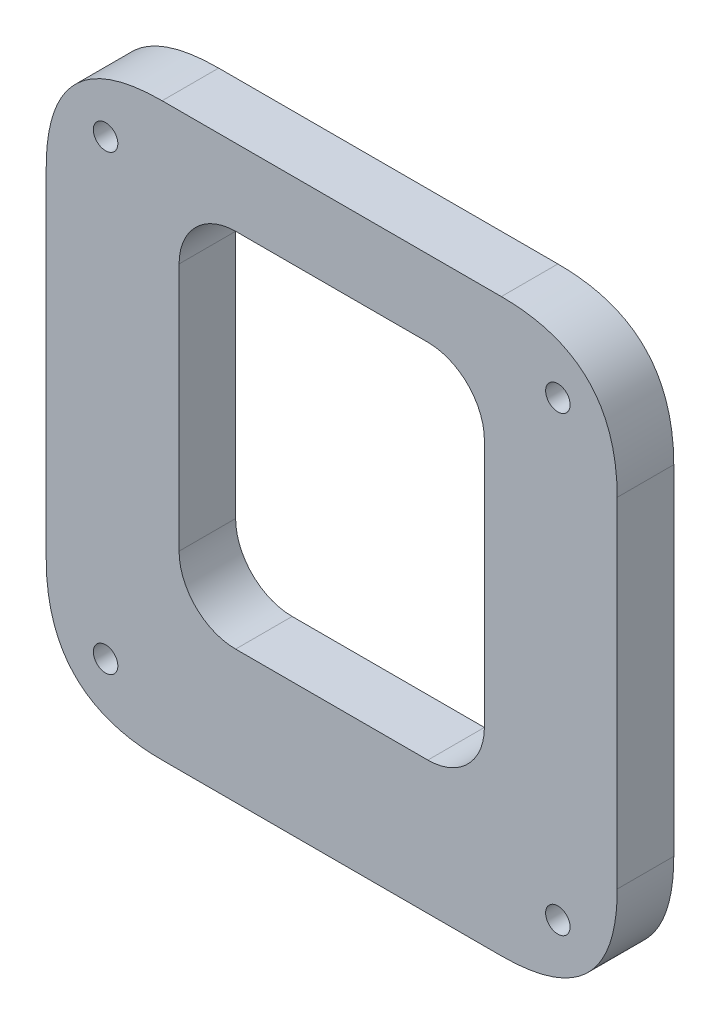
ISO-10303-21;
HEADER;
FILE_DESCRIPTION(('STEP AP214'),'2;1');
FILE_NAME('part.step','',(''),(''),'','','');
FILE_SCHEMA(('AUTOMOTIVE_DESIGN { 1 0 10303 214 1 1 1 1 }'));
ENDSEC;
DATA;
#1=APPLICATION_CONTEXT('core data for automotive mechanical design processes');
#2=APPLICATION_PROTOCOL_DEFINITION('international standard','automotive_design',2000,#1);
#3=PRODUCT_CONTEXT('',#1,'mechanical');
#4=PRODUCT('Part','Part','',(#3));
#5=PRODUCT_RELATED_PRODUCT_CATEGORY('part','',(#4));
#6=PRODUCT_DEFINITION_FORMATION('','',#4);
#7=PRODUCT_DEFINITION_CONTEXT('part definition',#1,'design');
#8=PRODUCT_DEFINITION('design','',#6,#7);
#9=PRODUCT_DEFINITION_SHAPE('','',#8);
#10=(LENGTH_UNIT() NAMED_UNIT(*) SI_UNIT(.MILLI.,.METRE.));
#11=(NAMED_UNIT(*) PLANE_ANGLE_UNIT() SI_UNIT($,.RADIAN.));
#12=(NAMED_UNIT(*) SI_UNIT($,.STERADIAN.) SOLID_ANGLE_UNIT());
#13=UNCERTAINTY_MEASURE_WITH_UNIT(LENGTH_MEASURE(1.E-05),#10,'distance_accuracy_value','');
#14=(GEOMETRIC_REPRESENTATION_CONTEXT(3) GLOBAL_UNCERTAINTY_ASSIGNED_CONTEXT((#13)) GLOBAL_UNIT_ASSIGNED_CONTEXT((#10,
#11,#12)) REPRESENTATION_CONTEXT('',''));
#15=CARTESIAN_POINT('',(0.,0.,0.));
#16=DIRECTION('',(0.,0.,1.));
#17=DIRECTION('',(1.,0.,0.));
#18=AXIS2_PLACEMENT_3D('',#15,#16,#17);
#19=CARTESIAN_POINT('',(60.72,60.72,-3.5));
#20=DIRECTION('',(0.,0.,1.));
#21=DIRECTION('',(1.,0.,0.));
#22=AXIS2_PLACEMENT_3D('',#19,#20,#21);
#23=PLANE('',#22);
#24=CARTESIAN_POINT('',(-40.,40.,-3.5));
#25=DIRECTION('',(0.,0.,1.));
#26=DIRECTION('',(1.,1.40812774357872E-11,0.));
#27=AXIS2_PLACEMENT_3D('',#24,#25,#26);
#28=CIRCLE('',#27,2.1660000004678);
#29=CARTESIAN_POINT('',(-42.1660000004678,39.9999999999695,-3.5));
#30=VERTEX_POINT('',#29);
#31=EDGE_CURVE('E192',#30,#30,#28,.T.);
#32=ORIENTED_EDGE('',*,*,#31,.T.);
#33=EDGE_LOOP('',(#32));
#34=FACE_BOUND('',#33,.T.);
#35=CARTESIAN_POINT('',(40.,40.,-3.5));
#36=DIRECTION('',(0.,0.,1.));
#37=DIRECTION('',(1.,1.40812774357872E-11,0.));
#38=AXIS2_PLACEMENT_3D('',#35,#36,#37);
#39=CIRCLE('',#38,2.1660000004678);
#40=CARTESIAN_POINT('',(37.8339999995322,39.9999999999695,-3.5));
#41=VERTEX_POINT('',#40);
#42=EDGE_CURVE('E196',#41,#41,#39,.T.);
#43=ORIENTED_EDGE('',*,*,#42,.T.);
#44=EDGE_LOOP('',(#43));
#45=FACE_BOUND('',#44,.T.);
#46=CARTESIAN_POINT('',(-40.,-40.,-3.5));
#47=DIRECTION('',(0.,0.,1.));
#48=DIRECTION('',(1.,1.40792271624273E-11,0.));
#49=AXIS2_PLACEMENT_3D('',#46,#47,#48);
#50=CIRCLE('',#49,2.1660000004678);
#51=CARTESIAN_POINT('',(-42.1660000004678,-40.0000000000305,-3.5));
#52=VERTEX_POINT('',#51);
#53=EDGE_CURVE('E282',#52,#52,#50,.T.);
#54=ORIENTED_EDGE('',*,*,#53,.T.);
#55=EDGE_LOOP('',(#54));
#56=FACE_BOUND('',#55,.T.);
#57=CARTESIAN_POINT('',(40.,-40.,-3.5));
#58=DIRECTION('',(0.,0.,1.));
#59=DIRECTION('',(1.,1.40792271624273E-11,0.));
#60=AXIS2_PLACEMENT_3D('',#57,#58,#59);
#61=CIRCLE('',#60,2.1660000004678);
#62=CARTESIAN_POINT('',(37.8339999995322,-40.0000000000305,-3.5));
#63=VERTEX_POINT('',#62);
#64=EDGE_CURVE('E231',#63,#63,#61,.T.);
#65=ORIENTED_EDGE('',*,*,#64,.T.);
#66=EDGE_LOOP('',(#65));
#67=FACE_BOUND('',#66,.T.);
#68=DIRECTION('',(0.,-1.,0.));
#69=VECTOR('',#68,1.);
#70=CARTESIAN_POINT('',(-27.0000000149012,43.86,-3.5));
#71=LINE('',#70,#69);
#72=CARTESIAN_POINT('',(-27.0000000149012,27.,-3.5));
#73=VERTEX_POINT('',#72);
#74=CARTESIAN_POINT('',(-27.0000000149011,-17.,-3.5));
#75=VERTEX_POINT('',#74);
#76=EDGE_CURVE('E281',#73,#75,#71,.T.);
#77=ORIENTED_EDGE('',*,*,#76,.T.);
#78=CARTESIAN_POINT('',(-17.,-17.,-3.5));
#79=DIRECTION('',(0.,0.,1.));
#80=DIRECTION('',(0.,-1.,0.));
#81=AXIS2_PLACEMENT_3D('',#78,#79,#80);
#82=CIRCLE('',#81,10.0000000149011);
#83=CARTESIAN_POINT('',(-17.,-27.0000000149012,-3.5));
#84=VERTEX_POINT('',#83);
#85=EDGE_CURVE('E201',#75,#84,#82,.T.);
#86=ORIENTED_EDGE('',*,*,#85,.T.);
#87=DIRECTION('',(1.,0.,0.));
#88=VECTOR('',#87,1.);
#89=CARTESIAN_POINT('',(21.86,-27.0000000149012,-3.5));
#90=LINE('',#89,#88);
#91=CARTESIAN_POINT('',(17.,-27.0000000149013,-3.5));
#92=VERTEX_POINT('',#91);
#93=EDGE_CURVE('E234',#84,#92,#90,.T.);
#94=ORIENTED_EDGE('',*,*,#93,.T.);
#95=CARTESIAN_POINT('',(17.,-17.,-3.5));
#96=DIRECTION('',(0.,0.,1.));
#97=DIRECTION('',(1.,0.,0.));
#98=AXIS2_PLACEMENT_3D('',#95,#96,#97);
#99=CIRCLE('',#98,10.0000000149012);
#100=CARTESIAN_POINT('',(27.0000000149012,-17.,-3.5));
#101=VERTEX_POINT('',#100);
#102=EDGE_CURVE('E21',#92,#101,#99,.T.);
#103=ORIENTED_EDGE('',*,*,#102,.T.);
#104=DIRECTION('',(0.,1.,0.));
#105=VECTOR('',#104,1.);
#106=CARTESIAN_POINT('',(27.0000000149012,21.86,-3.5));
#107=LINE('',#106,#105);
#108=CARTESIAN_POINT('',(27.0000000149012,27.,-3.5));
#109=VERTEX_POINT('',#108);
#110=EDGE_CURVE('E142',#101,#109,#107,.T.);
#111=ORIENTED_EDGE('',*,*,#110,.T.);
#112=CARTESIAN_POINT('',(17.,27.,-3.5));
#113=DIRECTION('',(0.,0.,1.));
#114=DIRECTION('',(0.,1.,0.));
#115=AXIS2_PLACEMENT_3D('',#112,#113,#114);
#116=CIRCLE('',#115,10.0000000149011);
#117=CARTESIAN_POINT('',(17.,37.0000000149011,-3.5));
#118=VERTEX_POINT('',#117);
#119=EDGE_CURVE('E345',#109,#118,#116,.T.);
#120=ORIENTED_EDGE('',*,*,#119,.T.);
#121=DIRECTION('',(-1.,0.,0.));
#122=VECTOR('',#121,1.);
#123=CARTESIAN_POINT('',(38.86,37.0000000149011,-3.5));
#124=LINE('',#123,#122);
#125=CARTESIAN_POINT('',(-17.,37.0000000149011,-3.5));
#126=VERTEX_POINT('',#125);
#127=EDGE_CURVE('E272',#118,#126,#124,.T.);
#128=ORIENTED_EDGE('',*,*,#127,.T.);
#129=CARTESIAN_POINT('',(-17.,27.,-3.5));
#130=DIRECTION('',(0.,0.,1.));
#131=DIRECTION('',(-1.,0.,0.));
#132=AXIS2_PLACEMENT_3D('',#129,#130,#131);
#133=CIRCLE('',#132,10.0000000149011);
#134=EDGE_CURVE('E222',#126,#73,#133,.T.);
#135=ORIENTED_EDGE('',*,*,#134,.T.);
#136=EDGE_LOOP('',(#77,#86,#94,#103,#111,#120,#128,#135));
#137=FACE_BOUND('',#136,.T.);
#138=CARTESIAN_POINT('',(-50.5,-30.,-3.5));
#139=CARTESIAN_POINT('',(-50.5,-37.3611962471327,-3.5));
#140=CARTESIAN_POINT('',(-48.4765265707625,-42.8270116661058,-3.5));
#141=CARTESIAN_POINT('',(-40.9522938769251,-49.101778205086,-3.5));
#142=CARTESIAN_POINT('',(-36.1388037528673,-50.5,-3.5));
#143=CARTESIAN_POINT('',(-30.,-50.5,-3.5));
#144=(BOUNDED_CURVE() B_SPLINE_CURVE(3,(#138,#139,#140,#141,#142,#143),.UNSPECIFIED.,.F.,
.F.) B_SPLINE_CURVE_WITH_KNOTS((4,2,4),(-34.138082637111,-15.5234807265474,0.),
.UNSPECIFIED.) CURVE() GEOMETRIC_REPRESENTATION_ITEM() RATIONAL_B_SPLINE_CURVE((1.,1.,1.,1.,1.,1.)) REPRESENTATION_ITEM(''));
#145=CARTESIAN_POINT('',(-50.5,-30.,-3.5));
#146=VERTEX_POINT('',#145);
#147=CARTESIAN_POINT('',(-30.,-50.5,-3.5));
#148=VERTEX_POINT('',#147);
#149=EDGE_CURVE('E11',#146,#148,#144,.T.);
#150=ORIENTED_EDGE('',*,*,#149,.F.);
#151=DIRECTION('',(0.,-1.,0.));
#152=VECTOR('',#151,1.);
#153=CARTESIAN_POINT('',(-50.5,30.,-3.5));
#154=LINE('',#153,#152);
#155=CARTESIAN_POINT('',(-50.5,30.,-3.5));
#156=VERTEX_POINT('',#155);
#157=EDGE_CURVE('E230',#156,#146,#154,.T.);
#158=ORIENTED_EDGE('',*,*,#157,.F.);
#159=CARTESIAN_POINT('',(-30.,50.5,-3.5));
#160=CARTESIAN_POINT('',(-37.3611962471327,50.5,-3.5));
#161=CARTESIAN_POINT('',(-42.8270116661058,48.4765265707626,-3.5));
#162=CARTESIAN_POINT('',(-49.1017782050861,40.9522938769252,-3.5));
#163=CARTESIAN_POINT('',(-50.5,36.1388037528673,-3.5));
#164=CARTESIAN_POINT('',(-50.5,30.,-3.5));
#165=(BOUNDED_CURVE() B_SPLINE_CURVE(3,(#159,#160,#161,#162,#163,#164),.UNSPECIFIED.,.F.,
.F.) B_SPLINE_CURVE_WITH_KNOTS((4,2,4),(-34.1380826371111,-15.5234807265475,0.),
.UNSPECIFIED.) CURVE() GEOMETRIC_REPRESENTATION_ITEM() RATIONAL_B_SPLINE_CURVE((1.,1.,1.,1.,1.,1.)) REPRESENTATION_ITEM(''));
#166=CARTESIAN_POINT('',(-30.,50.5,-3.5));
#167=VERTEX_POINT('',#166);
#168=EDGE_CURVE('E298',#167,#156,#165,.T.);
#169=ORIENTED_EDGE('',*,*,#168,.F.);
#170=DIRECTION('',(-1.,0.,0.));
#171=VECTOR('',#170,1.);
#172=CARTESIAN_POINT('',(30.,50.5,-3.5));
#173=LINE('',#172,#171);
#174=CARTESIAN_POINT('',(30.,50.5,-3.5));
#175=VERTEX_POINT('',#174);
#176=EDGE_CURVE('E294',#175,#167,#173,.T.);
#177=ORIENTED_EDGE('',*,*,#176,.F.);
#178=CARTESIAN_POINT('',(50.5,30.,-3.5));
#179=CARTESIAN_POINT('',(50.5,37.3611962471327,-3.5));
#180=CARTESIAN_POINT('',(48.4765265707625,42.8270116661058,-3.5));
#181=CARTESIAN_POINT('',(40.9522938769251,49.101778205086,-3.5));
#182=CARTESIAN_POINT('',(36.1388037528673,50.5,-3.5));
#183=CARTESIAN_POINT('',(30.,50.5,-3.5));
#184=(BOUNDED_CURVE() B_SPLINE_CURVE(3,(#178,#179,#180,#181,#182,#183),.UNSPECIFIED.,.F.,
.F.) B_SPLINE_CURVE_WITH_KNOTS((4,2,4),(-34.138082637111,-15.5234807265474,0.),
.UNSPECIFIED.) CURVE() GEOMETRIC_REPRESENTATION_ITEM() RATIONAL_B_SPLINE_CURVE((1.,1.,1.,1.,1.,1.)) REPRESENTATION_ITEM(''));
#185=CARTESIAN_POINT('',(50.5,30.,-3.5));
#186=VERTEX_POINT('',#185);
#187=EDGE_CURVE('E293',#186,#175,#184,.T.);
#188=ORIENTED_EDGE('',*,*,#187,.F.);
#189=DIRECTION('',(0.,1.,0.));
#190=VECTOR('',#189,1.);
#191=CARTESIAN_POINT('',(50.5,-30.,-3.5));
#192=LINE('',#191,#190);
#193=CARTESIAN_POINT('',(50.5,-30.,-3.5));
#194=VERTEX_POINT('',#193);
#195=EDGE_CURVE('E248',#194,#186,#192,.T.);
#196=ORIENTED_EDGE('',*,*,#195,.F.);
#197=CARTESIAN_POINT('',(30.,-50.5,-3.5));
#198=CARTESIAN_POINT('',(37.3611962471328,-50.5,-3.5));
#199=CARTESIAN_POINT('',(42.8270116661059,-48.4765265707625,-3.5));
#200=CARTESIAN_POINT('',(49.1017782050861,-40.952293876925,-3.5));
#201=CARTESIAN_POINT('',(50.5,-36.1388037528672,-3.5));
#202=CARTESIAN_POINT('',(50.5,-30.,-3.5));
#203=(BOUNDED_CURVE() B_SPLINE_CURVE(3,(#197,#198,#199,#200,#201,#202),.UNSPECIFIED.,.F.,
.F.) B_SPLINE_CURVE_WITH_KNOTS((4,2,4),(-34.1380826371111,-15.5234807265473,0.),
.UNSPECIFIED.) CURVE() GEOMETRIC_REPRESENTATION_ITEM() RATIONAL_B_SPLINE_CURVE((1.,1.,1.,1.,1.,1.)) REPRESENTATION_ITEM(''));
#204=CARTESIAN_POINT('',(30.,-50.5,-3.5));
#205=VERTEX_POINT('',#204);
#206=EDGE_CURVE('E221',#205,#194,#203,.T.);
#207=ORIENTED_EDGE('',*,*,#206,.F.);
#208=DIRECTION('',(1.,0.,0.));
#209=VECTOR('',#208,1.);
#210=CARTESIAN_POINT('',(-30.,-50.5,-3.5));
#211=LINE('',#210,#209);
#212=EDGE_CURVE('E220',#148,#205,#211,.T.);
#213=ORIENTED_EDGE('',*,*,#212,.F.);
#214=EDGE_LOOP('',(#150,#158,#169,#177,#188,#196,#207,#213));
#215=FACE_BOUND('',#214,.T.);
#216=ADVANCED_FACE('F17',(#34,#45,#56,#67,#137,#215),#23,.F.);
#217=CARTESIAN_POINT('',(-50.5,-30.,-3.5));
#218=CARTESIAN_POINT('',(-50.5,-30.,8.5));
#219=CARTESIAN_POINT('',(-50.5,-37.3611962471327,-3.5));
#220=CARTESIAN_POINT('',(-50.5,-37.3611962471327,8.5));
#221=CARTESIAN_POINT('',(-48.4765265707625,-42.8270116661058,-3.5));
#222=CARTESIAN_POINT('',(-48.4765265707625,-42.8270116661058,8.5));
#223=CARTESIAN_POINT('',(-44.3737596471752,-46.2484774363558,-3.5));
#224=CARTESIAN_POINT('',(-44.3737596471752,-46.2484774363558,8.5));
#225=CARTESIAN_POINT('',(-40.9522938769251,-49.101778205086,-3.5));
#226=CARTESIAN_POINT('',(-40.9522938769251,-49.101778205086,8.5));
#227=CARTESIAN_POINT('',(-36.1388037528673,-50.5,-3.5));
#228=CARTESIAN_POINT('',(-36.1388037528673,-50.5,8.5));
#229=CARTESIAN_POINT('',(-30.,-50.5,-3.5));
#230=CARTESIAN_POINT('',(-30.,-50.5,8.5));
#231=(BOUNDED_SURFACE() B_SPLINE_SURFACE(3,1,((#217,#218),(#219,#220),(#221,#222),(#223,#224),
(#225,#226),(#227,#228),(#229,#230)),.UNSPECIFIED.,.F.,.F.,.F.) B_SPLINE_SURFACE_WITH_KNOTS((4,
3,4),(2,2),(-34.138082637111,-15.5234807265474,0.),(0.,1.2),
.UNSPECIFIED.) GEOMETRIC_REPRESENTATION_ITEM() RATIONAL_B_SPLINE_SURFACE(((1.,1.),(1.,1.),(1.,
1.),(1.,1.),(1.,1.),(1.,1.),(1.,1.))) REPRESENTATION_ITEM('') SURFACE());
#232=DIRECTION('',(0.,0.,1.));
#233=VECTOR('',#232,1.);
#234=CARTESIAN_POINT('',(-30.,-50.5,-3.5));
#235=LINE('',#234,#233);
#236=CARTESIAN_POINT('',(-30.,-50.5,6.5));
#237=VERTEX_POINT('',#236);
#238=EDGE_CURVE('E28',#148,#237,#235,.T.);
#239=CARTESIAN_POINT('',(-50.5,-30.,6.5));
#240=CARTESIAN_POINT('',(-50.5,-37.3611962471327,6.5));
#241=CARTESIAN_POINT('',(-48.4765265707625,-42.8270116661058,6.5));
#242=CARTESIAN_POINT('',(-40.9522938769251,-49.101778205086,6.5));
#243=CARTESIAN_POINT('',(-36.1388037528673,-50.5,6.5));
#244=CARTESIAN_POINT('',(-30.,-50.5,6.5));
#245=(BOUNDED_CURVE() B_SPLINE_CURVE(3,(#239,#240,#241,#242,#243,#244),.UNSPECIFIED.,.F.,
.F.) B_SPLINE_CURVE_WITH_KNOTS((4,2,4),(-34.138082637111,-15.5234807265474,0.),
.UNSPECIFIED.) CURVE() GEOMETRIC_REPRESENTATION_ITEM() RATIONAL_B_SPLINE_CURVE((1.,1.,1.,1.,1.,1.)) REPRESENTATION_ITEM(''));
#246=CARTESIAN_POINT('',(-50.5,-30.,6.5));
#247=VERTEX_POINT('',#246);
#248=EDGE_CURVE('E299',#247,#237,#245,.T.);
#249=DIRECTION('',(0.,0.,1.));
#250=VECTOR('',#249,1.);
#251=CARTESIAN_POINT('',(-50.5,-30.,-3.5));
#252=LINE('',#251,#250);
#253=EDGE_CURVE('E241',#146,#247,#252,.T.);
#254=ORIENTED_EDGE('',*,*,#149,.T.);
#255=ORIENTED_EDGE('',*,*,#238,.T.);
#256=ORIENTED_EDGE('',*,*,#248,.F.);
#257=ORIENTED_EDGE('',*,*,#253,.F.);
#258=EDGE_LOOP('',(#254,#255,#256,#257));
#259=FACE_BOUND('',#258,.T.);
#260=ADVANCED_FACE('F454',(#259),#231,.T.);
#261=CARTESIAN_POINT('',(-30.,-50.5,-3.5));
#262=DIRECTION('',(0.,-1.,0.));
#263=DIRECTION('',(0.,0.,-1.));
#264=AXIS2_PLACEMENT_3D('',#261,#262,#263);
#265=PLANE('',#264);
#266=ORIENTED_EDGE('',*,*,#212,.T.);
#267=DIRECTION('',(0.,0.,1.));
#268=VECTOR('',#267,1.);
#269=CARTESIAN_POINT('',(30.,-50.5,-3.5));
#270=LINE('',#269,#268);
#271=CARTESIAN_POINT('',(30.,-50.5,6.5));
#272=VERTEX_POINT('',#271);
#273=EDGE_CURVE('E216',#205,#272,#270,.T.);
#274=ORIENTED_EDGE('',*,*,#273,.T.);
#275=DIRECTION('',(1.,0.,0.));
#276=VECTOR('',#275,1.);
#277=CARTESIAN_POINT('',(-30.,-50.5,6.5));
#278=LINE('',#277,#276);
#279=EDGE_CURVE('E305',#237,#272,#278,.T.);
#280=ORIENTED_EDGE('',*,*,#279,.F.);
#281=ORIENTED_EDGE('',*,*,#238,.F.);
#282=EDGE_LOOP('',(#266,#274,#280,#281));
#283=FACE_BOUND('',#282,.T.);
#284=ADVANCED_FACE('F461',(#283),#265,.T.);
#285=CARTESIAN_POINT('',(30.,-50.5,-3.5));
#286=CARTESIAN_POINT('',(30.,-50.5,8.5));
#287=CARTESIAN_POINT('',(37.3611962471328,-50.5,-3.5));
#288=CARTESIAN_POINT('',(37.3611962471328,-50.5,8.5));
#289=CARTESIAN_POINT('',(42.8270116661059,-48.4765265707625,-3.5));
#290=CARTESIAN_POINT('',(42.8270116661059,-48.4765265707625,8.5));
#291=CARTESIAN_POINT('',(46.2484774363559,-44.373759647175,-3.5));
#292=CARTESIAN_POINT('',(46.2484774363559,-44.373759647175,8.5));
#293=CARTESIAN_POINT('',(49.1017782050861,-40.952293876925,-3.5));
#294=CARTESIAN_POINT('',(49.1017782050861,-40.952293876925,8.5));
#295=CARTESIAN_POINT('',(50.5,-36.1388037528672,-3.5));
#296=CARTESIAN_POINT('',(50.5,-36.1388037528672,8.5));
#297=CARTESIAN_POINT('',(50.5,-30.,-3.5));
#298=CARTESIAN_POINT('',(50.5,-30.,8.5));
#299=(BOUNDED_SURFACE() B_SPLINE_SURFACE(3,1,((#285,#286),(#287,#288),(#289,#290),(#291,#292),
(#293,#294),(#295,#296),(#297,#298)),.UNSPECIFIED.,.F.,.F.,.F.) B_SPLINE_SURFACE_WITH_KNOTS((4,
3,4),(2,2),(-34.1380826371111,-15.5234807265473,0.),(0.,1.2),
.UNSPECIFIED.) GEOMETRIC_REPRESENTATION_ITEM() RATIONAL_B_SPLINE_SURFACE(((1.,1.),(1.,1.),(1.,
1.),(1.,1.),(1.,1.),(1.,1.),(1.,1.))) REPRESENTATION_ITEM('') SURFACE());
#300=DIRECTION('',(0.,0.,1.));
#301=VECTOR('',#300,1.);
#302=CARTESIAN_POINT('',(50.5,-30.,-3.5));
#303=LINE('',#302,#301);
#304=CARTESIAN_POINT('',(50.5,-30.,6.5));
#305=VERTEX_POINT('',#304);
#306=EDGE_CURVE('E245',#194,#305,#303,.T.);
#307=CARTESIAN_POINT('',(30.,-50.5,6.5));
#308=CARTESIAN_POINT('',(37.3611962471328,-50.5,6.5));
#309=CARTESIAN_POINT('',(42.8270116661059,-48.4765265707625,6.5));
#310=CARTESIAN_POINT('',(49.1017782050861,-40.952293876925,6.5));
#311=CARTESIAN_POINT('',(50.5,-36.1388037528672,6.5));
#312=CARTESIAN_POINT('',(50.5,-30.,6.5));
#313=(BOUNDED_CURVE() B_SPLINE_CURVE(3,(#307,#308,#309,#310,#311,#312),.UNSPECIFIED.,.F.,
.F.) B_SPLINE_CURVE_WITH_KNOTS((4,2,4),(-34.1380826371111,-15.5234807265473,0.),
.UNSPECIFIED.) CURVE() GEOMETRIC_REPRESENTATION_ITEM() RATIONAL_B_SPLINE_CURVE((1.,1.,1.,1.,1.,1.)) REPRESENTATION_ITEM(''));
#314=EDGE_CURVE('E318',#272,#305,#313,.T.);
#315=ORIENTED_EDGE('',*,*,#206,.T.);
#316=ORIENTED_EDGE('',*,*,#306,.T.);
#317=ORIENTED_EDGE('',*,*,#314,.F.);
#318=ORIENTED_EDGE('',*,*,#273,.F.);
#319=EDGE_LOOP('',(#315,#316,#317,#318));
#320=FACE_BOUND('',#319,.T.);
#321=ADVANCED_FACE('F466',(#320),#299,.T.);
#322=CARTESIAN_POINT('',(50.5,-30.,-3.5));
#323=DIRECTION('',(1.,0.,0.));
#324=DIRECTION('',(0.,1.,0.));
#325=AXIS2_PLACEMENT_3D('',#322,#323,#324);
#326=PLANE('',#325);
#327=ORIENTED_EDGE('',*,*,#195,.T.);
#328=DIRECTION('',(0.,0.,1.));
#329=VECTOR('',#328,1.);
#330=CARTESIAN_POINT('',(50.5,30.,-3.5));
#331=LINE('',#330,#329);
#332=CARTESIAN_POINT('',(50.5,30.,6.5));
#333=VERTEX_POINT('',#332);
#334=EDGE_CURVE('E417',#186,#333,#331,.T.);
#335=ORIENTED_EDGE('',*,*,#334,.T.);
#336=DIRECTION('',(0.,1.,0.));
#337=VECTOR('',#336,1.);
#338=CARTESIAN_POINT('',(50.5,-30.,6.5));
#339=LINE('',#338,#337);
#340=EDGE_CURVE('E324',#305,#333,#339,.T.);
#341=ORIENTED_EDGE('',*,*,#340,.F.);
#342=ORIENTED_EDGE('',*,*,#306,.F.);
#343=EDGE_LOOP('',(#327,#335,#341,#342));
#344=FACE_BOUND('',#343,.T.);
#345=ADVANCED_FACE('F471',(#344),#326,.T.);
#346=CARTESIAN_POINT('',(50.5,30.,-3.5));
#347=CARTESIAN_POINT('',(50.5,30.,8.5));
#348=CARTESIAN_POINT('',(50.5,37.3611962471327,-3.5));
#349=CARTESIAN_POINT('',(50.5,37.3611962471327,8.5));
#350=CARTESIAN_POINT('',(48.4765265707625,42.8270116661058,-3.5));
#351=CARTESIAN_POINT('',(48.4765265707625,42.8270116661058,8.5));
#352=CARTESIAN_POINT('',(44.3737596471752,46.2484774363558,-3.5));
#353=CARTESIAN_POINT('',(44.3737596471752,46.2484774363558,8.5));
#354=CARTESIAN_POINT('',(40.9522938769251,49.101778205086,-3.5));
#355=CARTESIAN_POINT('',(40.9522938769251,49.101778205086,8.5));
#356=CARTESIAN_POINT('',(36.1388037528673,50.5,-3.5));
#357=CARTESIAN_POINT('',(36.1388037528673,50.5,8.5));
#358=CARTESIAN_POINT('',(30.,50.5,-3.5));
#359=CARTESIAN_POINT('',(30.,50.5,8.5));
#360=(BOUNDED_SURFACE() B_SPLINE_SURFACE(3,1,((#346,#347),(#348,#349),(#350,#351),(#352,#353),
(#354,#355),(#356,#357),(#358,#359)),.UNSPECIFIED.,.F.,.F.,.F.) B_SPLINE_SURFACE_WITH_KNOTS((4,
3,4),(2,2),(-34.138082637111,-15.5234807265474,0.),(0.,1.2),
.UNSPECIFIED.) GEOMETRIC_REPRESENTATION_ITEM() RATIONAL_B_SPLINE_SURFACE(((1.,1.),(1.,1.),(1.,
1.),(1.,1.),(1.,1.),(1.,1.),(1.,1.))) REPRESENTATION_ITEM('') SURFACE());
#361=DIRECTION('',(0.,0.,1.));
#362=VECTOR('',#361,1.);
#363=CARTESIAN_POINT('',(30.,50.5,-3.5));
#364=LINE('',#363,#362);
#365=CARTESIAN_POINT('',(30.,50.5,6.5));
#366=VERTEX_POINT('',#365);
#367=EDGE_CURVE('E290',#175,#366,#364,.T.);
#368=CARTESIAN_POINT('',(50.5,30.,6.5));
#369=CARTESIAN_POINT('',(50.5,37.3611962471327,6.5));
#370=CARTESIAN_POINT('',(48.4765265707625,42.8270116661058,6.5));
#371=CARTESIAN_POINT('',(40.9522938769251,49.101778205086,6.5));
#372=CARTESIAN_POINT('',(36.1388037528673,50.5,6.5));
#373=CARTESIAN_POINT('',(30.,50.5,6.5));
#374=(BOUNDED_CURVE() B_SPLINE_CURVE(3,(#368,#369,#370,#371,#372,#373),.UNSPECIFIED.,.F.,
.F.) B_SPLINE_CURVE_WITH_KNOTS((4,2,4),(-34.138082637111,-15.5234807265474,0.),
.UNSPECIFIED.) CURVE() GEOMETRIC_REPRESENTATION_ITEM() RATIONAL_B_SPLINE_CURVE((1.,1.,1.,1.,1.,1.)) REPRESENTATION_ITEM(''));
#375=EDGE_CURVE('E263',#333,#366,#374,.T.);
#376=ORIENTED_EDGE('',*,*,#187,.T.);
#377=ORIENTED_EDGE('',*,*,#367,.T.);
#378=ORIENTED_EDGE('',*,*,#375,.F.);
#379=ORIENTED_EDGE('',*,*,#334,.F.);
#380=EDGE_LOOP('',(#376,#377,#378,#379));
#381=FACE_BOUND('',#380,.T.);
#382=ADVANCED_FACE('F510',(#381),#360,.T.);
#383=CARTESIAN_POINT('',(30.,50.5,-3.5));
#384=DIRECTION('',(0.,1.,0.));
#385=DIRECTION('',(1.,0.,0.));
#386=AXIS2_PLACEMENT_3D('',#383,#384,#385);
#387=PLANE('',#386);
#388=ORIENTED_EDGE('',*,*,#176,.T.);
#389=DIRECTION('',(0.,0.,1.));
#390=VECTOR('',#389,1.);
#391=CARTESIAN_POINT('',(-30.,50.5,-3.5));
#392=LINE('',#391,#390);
#393=CARTESIAN_POINT('',(-30.,50.5,6.5));
#394=VERTEX_POINT('',#393);
#395=EDGE_CURVE('E295',#167,#394,#392,.T.);
#396=ORIENTED_EDGE('',*,*,#395,.T.);
#397=DIRECTION('',(-1.,0.,0.));
#398=VECTOR('',#397,1.);
#399=CARTESIAN_POINT('',(30.,50.5,6.5));
#400=LINE('',#399,#398);
#401=EDGE_CURVE('E258',#366,#394,#400,.T.);
#402=ORIENTED_EDGE('',*,*,#401,.F.);
#403=ORIENTED_EDGE('',*,*,#367,.F.);
#404=EDGE_LOOP('',(#388,#396,#402,#403));
#405=FACE_BOUND('',#404,.T.);
#406=ADVANCED_FACE('F513',(#405),#387,.T.);
#407=CARTESIAN_POINT('',(-30.,50.5,-3.5));
#408=CARTESIAN_POINT('',(-30.,50.5,8.5));
#409=CARTESIAN_POINT('',(-37.3611962471327,50.5,-3.5));
#410=CARTESIAN_POINT('',(-37.3611962471327,50.5,8.5));
#411=CARTESIAN_POINT('',(-42.8270116661058,48.4765265707626,-3.5));
#412=CARTESIAN_POINT('',(-42.8270116661058,48.4765265707626,8.5));
#413=CARTESIAN_POINT('',(-46.2484774363558,44.3737596471752,-3.5));
#414=CARTESIAN_POINT('',(-46.2484774363558,44.3737596471752,8.5));
#415=CARTESIAN_POINT('',(-49.1017782050861,40.9522938769252,-3.5));
#416=CARTESIAN_POINT('',(-49.1017782050861,40.9522938769252,8.5));
#417=CARTESIAN_POINT('',(-50.5,36.1388037528673,-3.5));
#418=CARTESIAN_POINT('',(-50.5,36.1388037528673,8.5));
#419=CARTESIAN_POINT('',(-50.5,30.,-3.5));
#420=CARTESIAN_POINT('',(-50.5,30.,8.5));
#421=(BOUNDED_SURFACE() B_SPLINE_SURFACE(3,1,((#407,#408),(#409,#410),(#411,#412),(#413,#414),
(#415,#416),(#417,#418),(#419,#420)),.UNSPECIFIED.,.F.,.F.,.F.) B_SPLINE_SURFACE_WITH_KNOTS((4,
3,4),(2,2),(-34.1380826371111,-15.5234807265475,0.),(0.,1.2),
.UNSPECIFIED.) GEOMETRIC_REPRESENTATION_ITEM() RATIONAL_B_SPLINE_SURFACE(((1.,1.),(1.,1.),(1.,
1.),(1.,1.),(1.,1.),(1.,1.),(1.,1.))) REPRESENTATION_ITEM('') SURFACE());
#422=DIRECTION('',(0.,0.,1.));
#423=VECTOR('',#422,1.);
#424=CARTESIAN_POINT('',(-50.5,30.,-3.5));
#425=LINE('',#424,#423);
#426=CARTESIAN_POINT('',(-50.5,30.,6.5));
#427=VERTEX_POINT('',#426);
#428=EDGE_CURVE('E244',#156,#427,#425,.T.);
#429=CARTESIAN_POINT('',(-30.,50.5,6.5));
#430=CARTESIAN_POINT('',(-37.3611962471327,50.5,6.5));
#431=CARTESIAN_POINT('',(-42.8270116661058,48.4765265707626,6.5));
#432=CARTESIAN_POINT('',(-49.1017782050861,40.9522938769252,6.5));
#433=CARTESIAN_POINT('',(-50.5,36.1388037528673,6.5));
#434=CARTESIAN_POINT('',(-50.5,30.,6.5));
#435=(BOUNDED_CURVE() B_SPLINE_CURVE(3,(#429,#430,#431,#432,#433,#434),.UNSPECIFIED.,.F.,
.F.) B_SPLINE_CURVE_WITH_KNOTS((4,2,4),(-34.1380826371111,-15.5234807265475,0.),
.UNSPECIFIED.) CURVE() GEOMETRIC_REPRESENTATION_ITEM() RATIONAL_B_SPLINE_CURVE((1.,1.,1.,1.,1.,1.)) REPRESENTATION_ITEM(''));
#436=EDGE_CURVE('E262',#394,#427,#435,.T.);
#437=ORIENTED_EDGE('',*,*,#168,.T.);
#438=ORIENTED_EDGE('',*,*,#428,.T.);
#439=ORIENTED_EDGE('',*,*,#436,.F.);
#440=ORIENTED_EDGE('',*,*,#395,.F.);
#441=EDGE_LOOP('',(#437,#438,#439,#440));
#442=FACE_BOUND('',#441,.T.);
#443=ADVANCED_FACE('F448',(#442),#421,.T.);
#444=CARTESIAN_POINT('',(-50.5,30.,-3.5));
#445=DIRECTION('',(-1.,0.,0.));
#446=DIRECTION('',(0.,0.,1.));
#447=AXIS2_PLACEMENT_3D('',#444,#445,#446);
#448=PLANE('',#447);
#449=ORIENTED_EDGE('',*,*,#157,.T.);
#450=ORIENTED_EDGE('',*,*,#253,.T.);
#451=DIRECTION('',(0.,-1.,0.));
#452=VECTOR('',#451,1.);
#453=CARTESIAN_POINT('',(-50.5,30.,6.5));
#454=LINE('',#453,#452);
#455=EDGE_CURVE('E357',#427,#247,#454,.T.);
#456=ORIENTED_EDGE('',*,*,#455,.F.);
#457=ORIENTED_EDGE('',*,*,#428,.F.);
#458=EDGE_LOOP('',(#449,#450,#456,#457));
#459=FACE_BOUND('',#458,.T.);
#460=ADVANCED_FACE('F453',(#459),#448,.T.);
#461=CARTESIAN_POINT('',(40.,-40.,-3.5));
#462=DIRECTION('',(0.,0.,1.));
#463=DIRECTION('',(1.,1.40792271624273E-11,0.));
#464=AXIS2_PLACEMENT_3D('',#461,#462,#463);
#465=CYLINDRICAL_SURFACE('',#464,2.1660000004678);
#466=ORIENTED_EDGE('',*,*,#64,.F.);
#467=DIRECTION('',(0.,0.,1.));
#468=VECTOR('',#467,1.);
#469=CARTESIAN_POINT('',(37.8339999995322,-40.0000000000305,-3.5));
#470=LINE('',#469,#468);
#471=CARTESIAN_POINT('',(37.8339999995322,-40.0000000000305,6.5));
#472=VERTEX_POINT('',#471);
#473=EDGE_CURVE('E227',#63,#472,#470,.T.);
#474=ORIENTED_EDGE('',*,*,#473,.T.);
#475=CARTESIAN_POINT('',(40.,-40.,6.5));
#476=DIRECTION('',(0.,0.,-1.));
#477=DIRECTION('',(1.,1.40792271624273E-11,0.));
#478=AXIS2_PLACEMENT_3D('',#475,#476,#477);
#479=CIRCLE('',#478,2.1660000004678);
#480=EDGE_CURVE('E264',#472,#472,#479,.T.);
#481=ORIENTED_EDGE('',*,*,#480,.F.);
#482=ORIENTED_EDGE('',*,*,#473,.F.);
#483=EDGE_LOOP('',(#466,#474,#481,#482));
#484=FACE_BOUND('',#483,.T.);
#485=ADVANCED_FACE('F500',(#484),#465,.F.);
#486=CARTESIAN_POINT('',(-40.,-40.,-3.5));
#487=DIRECTION('',(0.,0.,1.));
#488=DIRECTION('',(1.,1.40792271624273E-11,0.));
#489=AXIS2_PLACEMENT_3D('',#486,#487,#488);
#490=CYLINDRICAL_SURFACE('',#489,2.1660000004678);
#491=ORIENTED_EDGE('',*,*,#53,.F.);
#492=DIRECTION('',(0.,0.,1.));
#493=VECTOR('',#492,1.);
#494=CARTESIAN_POINT('',(-42.1660000004678,-40.0000000000305,-3.5));
#495=LINE('',#494,#493);
#496=CARTESIAN_POINT('',(-42.1660000004678,-40.0000000000305,6.5));
#497=VERTEX_POINT('',#496);
#498=EDGE_CURVE('E286',#52,#497,#495,.T.);
#499=ORIENTED_EDGE('',*,*,#498,.T.);
#500=CARTESIAN_POINT('',(-40.,-40.,6.5));
#501=DIRECTION('',(0.,0.,-1.));
#502=DIRECTION('',(1.,1.40792271624273E-11,0.));
#503=AXIS2_PLACEMENT_3D('',#500,#501,#502);
#504=CIRCLE('',#503,2.1660000004678);
#505=EDGE_CURVE('E268',#497,#497,#504,.T.);
#506=ORIENTED_EDGE('',*,*,#505,.F.);
#507=ORIENTED_EDGE('',*,*,#498,.F.);
#508=EDGE_LOOP('',(#491,#499,#506,#507));
#509=FACE_BOUND('',#508,.T.);
#510=ADVANCED_FACE('F491',(#509),#490,.F.);
#511=CARTESIAN_POINT('',(40.,40.,-3.5));
#512=DIRECTION('',(0.,0.,1.));
#513=DIRECTION('',(1.,1.40812774357872E-11,0.));
#514=AXIS2_PLACEMENT_3D('',#511,#512,#513);
#515=CYLINDRICAL_SURFACE('',#514,2.1660000004678);
#516=ORIENTED_EDGE('',*,*,#42,.F.);
#517=DIRECTION('',(0.,0.,1.));
#518=VECTOR('',#517,1.);
#519=CARTESIAN_POINT('',(37.8339999995322,39.9999999999695,-3.5));
#520=LINE('',#519,#518);
#521=CARTESIAN_POINT('',(37.8339999995322,39.9999999999695,6.5));
#522=VERTEX_POINT('',#521);
#523=EDGE_CURVE('E277',#41,#522,#520,.T.);
#524=ORIENTED_EDGE('',*,*,#523,.T.);
#525=CARTESIAN_POINT('',(40.,40.,6.5));
#526=DIRECTION('',(0.,0.,-1.));
#527=DIRECTION('',(1.,1.40812774357872E-11,0.));
#528=AXIS2_PLACEMENT_3D('',#525,#526,#527);
#529=CIRCLE('',#528,2.1660000004678);
#530=EDGE_CURVE('E306',#522,#522,#529,.T.);
#531=ORIENTED_EDGE('',*,*,#530,.F.);
#532=ORIENTED_EDGE('',*,*,#523,.F.);
#533=EDGE_LOOP('',(#516,#524,#531,#532));
#534=FACE_BOUND('',#533,.T.);
#535=ADVANCED_FACE('F19',(#534),#515,.F.);
#536=CARTESIAN_POINT('',(-40.,40.,-3.5));
#537=DIRECTION('',(0.,0.,1.));
#538=DIRECTION('',(1.,1.40812774357872E-11,0.));
#539=AXIS2_PLACEMENT_3D('',#536,#537,#538);
#540=CYLINDRICAL_SURFACE('',#539,2.1660000004678);
#541=ORIENTED_EDGE('',*,*,#31,.F.);
#542=DIRECTION('',(0.,0.,1.));
#543=VECTOR('',#542,1.);
#544=CARTESIAN_POINT('',(-42.1660000004678,39.9999999999695,-3.5));
#545=LINE('',#544,#543);
#546=CARTESIAN_POINT('',(-42.1660000004678,39.9999999999695,6.5));
#547=VERTEX_POINT('',#546);
#548=EDGE_CURVE('E189',#30,#547,#545,.T.);
#549=ORIENTED_EDGE('',*,*,#548,.T.);
#550=CARTESIAN_POINT('',(-40.,40.,6.5));
#551=DIRECTION('',(0.,0.,-1.));
#552=DIRECTION('',(1.,1.40812774357872E-11,0.));
#553=AXIS2_PLACEMENT_3D('',#550,#551,#552);
#554=CIRCLE('',#553,2.1660000004678);
#555=EDGE_CURVE('E194',#547,#547,#554,.T.);
#556=ORIENTED_EDGE('',*,*,#555,.F.);
#557=ORIENTED_EDGE('',*,*,#548,.F.);
#558=EDGE_LOOP('',(#541,#549,#556,#557));
#559=FACE_BOUND('',#558,.T.);
#560=ADVANCED_FACE('F191',(#559),#540,.F.);
#561=CARTESIAN_POINT('',(-17.,-17.,-3.5));
#562=DIRECTION('',(0.,0.,1.));
#563=DIRECTION('',(0.,-1.,0.));
#564=AXIS2_PLACEMENT_3D('',#561,#562,#563);
#565=CYLINDRICAL_SURFACE('',#564,10.0000000149011);
#566=DIRECTION('',(0.,0.,1.));
#567=VECTOR('',#566,1.);
#568=CARTESIAN_POINT('',(-17.,-27.0000000149012,1.5));
#569=LINE('',#568,#567);
#570=CARTESIAN_POINT('',(-17.,-27.0000000149012,6.5));
#571=VERTEX_POINT('',#570);
#572=EDGE_CURVE('E207',#84,#571,#569,.T.);
#573=ORIENTED_EDGE('',*,*,#572,.F.);
#574=ORIENTED_EDGE('',*,*,#85,.F.);
#575=DIRECTION('',(0.,0.,1.));
#576=VECTOR('',#575,1.);
#577=CARTESIAN_POINT('',(-27.0000000149011,-17.,-3.5));
#578=LINE('',#577,#576);
#579=CARTESIAN_POINT('',(-27.0000000149011,-17.,6.5));
#580=VERTEX_POINT('',#579);
#581=EDGE_CURVE('E278',#75,#580,#578,.T.);
#582=ORIENTED_EDGE('',*,*,#581,.T.);
#583=CARTESIAN_POINT('',(-17.,-17.,6.5));
#584=DIRECTION('',(0.,0.,-1.));
#585=DIRECTION('',(0.,-1.,0.));
#586=AXIS2_PLACEMENT_3D('',#583,#584,#585);
#587=CIRCLE('',#586,10.0000000149011);
#588=EDGE_CURVE('E269',#571,#580,#587,.T.);
#589=ORIENTED_EDGE('',*,*,#588,.F.);
#590=EDGE_LOOP('',(#573,#574,#582,#589));
#591=FACE_BOUND('',#590,.T.);
#592=ADVANCED_FACE('F381',(#591),#565,.F.);
#593=CARTESIAN_POINT('',(-17.,-27.0000000149012,-3.5));
#594=DIRECTION('',(0.,-1.,0.));
#595=DIRECTION('',(0.,0.,-1.));
#596=AXIS2_PLACEMENT_3D('',#593,#594,#595);
#597=PLANE('',#596);
#598=DIRECTION('',(0.,0.,1.));
#599=VECTOR('',#598,1.);
#600=CARTESIAN_POINT('',(17.,-27.0000000149013,1.5));
#601=LINE('',#600,#599);
#602=CARTESIAN_POINT('',(17.,-27.0000000149013,6.5));
#603=VERTEX_POINT('',#602);
#604=EDGE_CURVE('E237',#92,#603,#601,.T.);
#605=ORIENTED_EDGE('',*,*,#604,.F.);
#606=ORIENTED_EDGE('',*,*,#93,.F.);
#607=ORIENTED_EDGE('',*,*,#572,.T.);
#608=DIRECTION('',(-1.,0.,0.));
#609=VECTOR('',#608,1.);
#610=CARTESIAN_POINT('',(21.86,-27.0000000149012,6.5));
#611=LINE('',#610,#609);
#612=EDGE_CURVE('E334',#603,#571,#611,.T.);
#613=ORIENTED_EDGE('',*,*,#612,.F.);
#614=EDGE_LOOP('',(#605,#606,#607,#613));
#615=FACE_BOUND('',#614,.T.);
#616=ADVANCED_FACE('F375',(#615),#597,.F.);
#617=CARTESIAN_POINT('',(17.,-17.,-3.5));
#618=DIRECTION('',(0.,0.,1.));
#619=DIRECTION('',(1.,0.,0.));
#620=AXIS2_PLACEMENT_3D('',#617,#618,#619);
#621=CYLINDRICAL_SURFACE('',#620,10.0000000149012);
#622=DIRECTION('',(0.,0.,1.));
#623=VECTOR('',#622,1.);
#624=CARTESIAN_POINT('',(27.0000000149012,-17.,1.5));
#625=LINE('',#624,#623);
#626=CARTESIAN_POINT('',(27.0000000149012,-17.,6.5));
#627=VERTEX_POINT('',#626);
#628=EDGE_CURVE('E213',#101,#627,#625,.T.);
#629=ORIENTED_EDGE('',*,*,#628,.F.);
#630=ORIENTED_EDGE('',*,*,#102,.F.);
#631=ORIENTED_EDGE('',*,*,#604,.T.);
#632=CARTESIAN_POINT('',(17.,-17.,6.5));
#633=DIRECTION('',(0.,0.,-1.));
#634=DIRECTION('',(1.,0.,0.));
#635=AXIS2_PLACEMENT_3D('',#632,#633,#634);
#636=CIRCLE('',#635,10.0000000149012);
#637=EDGE_CURVE('E331',#627,#603,#636,.T.);
#638=ORIENTED_EDGE('',*,*,#637,.F.);
#639=EDGE_LOOP('',(#629,#630,#631,#638));
#640=FACE_BOUND('',#639,.T.);
#641=ADVANCED_FACE('F542',(#640),#621,.F.);
#642=CARTESIAN_POINT('',(27.0000000149012,-17.,-3.5));
#643=DIRECTION('',(1.,0.,0.));
#644=DIRECTION('',(0.,1.,0.));
#645=AXIS2_PLACEMENT_3D('',#642,#643,#644);
#646=PLANE('',#645);
#647=DIRECTION('',(0.,0.,1.));
#648=VECTOR('',#647,1.);
#649=CARTESIAN_POINT('',(27.0000000149012,27.,1.5));
#650=LINE('',#649,#648);
#651=CARTESIAN_POINT('',(27.0000000149012,27.,6.5));
#652=VERTEX_POINT('',#651);
#653=EDGE_CURVE('E339',#109,#652,#650,.T.);
#654=ORIENTED_EDGE('',*,*,#653,.F.);
#655=ORIENTED_EDGE('',*,*,#110,.F.);
#656=ORIENTED_EDGE('',*,*,#628,.T.);
#657=DIRECTION('',(0.,-1.,0.));
#658=VECTOR('',#657,1.);
#659=CARTESIAN_POINT('',(27.0000000149012,21.86,6.5));
#660=LINE('',#659,#658);
#661=EDGE_CURVE('E335',#652,#627,#660,.T.);
#662=ORIENTED_EDGE('',*,*,#661,.F.);
#663=EDGE_LOOP('',(#654,#655,#656,#662));
#664=FACE_BOUND('',#663,.T.);
#665=ADVANCED_FACE('F540',(#664),#646,.F.);
#666=CARTESIAN_POINT('',(17.,27.,-3.5));
#667=DIRECTION('',(0.,0.,1.));
#668=DIRECTION('',(0.,1.,0.));
#669=AXIS2_PLACEMENT_3D('',#666,#667,#668);
#670=CYLINDRICAL_SURFACE('',#669,10.0000000149011);
#671=DIRECTION('',(0.,0.,1.));
#672=VECTOR('',#671,1.);
#673=CARTESIAN_POINT('',(17.,37.0000000149011,1.5));
#674=LINE('',#673,#672);
#675=CARTESIAN_POINT('',(17.,37.0000000149011,6.5));
#676=VERTEX_POINT('',#675);
#677=EDGE_CURVE('E348',#118,#676,#674,.T.);
#678=ORIENTED_EDGE('',*,*,#677,.F.);
#679=ORIENTED_EDGE('',*,*,#119,.F.);
#680=ORIENTED_EDGE('',*,*,#653,.T.);
#681=CARTESIAN_POINT('',(17.,27.,6.5));
#682=DIRECTION('',(0.,0.,-1.));
#683=DIRECTION('',(0.,1.,0.));
#684=AXIS2_PLACEMENT_3D('',#681,#682,#683);
#685=CIRCLE('',#684,10.0000000149011);
#686=EDGE_CURVE('E349',#676,#652,#685,.T.);
#687=ORIENTED_EDGE('',*,*,#686,.F.);
#688=EDGE_LOOP('',(#678,#679,#680,#687));
#689=FACE_BOUND('',#688,.T.);
#690=ADVANCED_FACE('F537',(#689),#670,.F.);
#691=CARTESIAN_POINT('',(17.,37.0000000149011,-3.5));
#692=DIRECTION('',(0.,1.,0.));
#693=DIRECTION('',(1.,0.,0.));
#694=AXIS2_PLACEMENT_3D('',#691,#692,#693);
#695=PLANE('',#694);
#696=DIRECTION('',(0.,0.,1.));
#697=VECTOR('',#696,1.);
#698=CARTESIAN_POINT('',(-17.,37.0000000149011,1.5));
#699=LINE('',#698,#697);
#700=CARTESIAN_POINT('',(-17.,37.0000000149011,6.5));
#701=VERTEX_POINT('',#700);
#702=EDGE_CURVE('E225',#126,#701,#699,.T.);
#703=ORIENTED_EDGE('',*,*,#702,.F.);
#704=ORIENTED_EDGE('',*,*,#127,.F.);
#705=ORIENTED_EDGE('',*,*,#677,.T.);
#706=DIRECTION('',(1.,0.,0.));
#707=VECTOR('',#706,1.);
#708=CARTESIAN_POINT('',(38.86,37.0000000149011,6.5));
#709=LINE('',#708,#707);
#710=EDGE_CURVE('E353',#701,#676,#709,.T.);
#711=ORIENTED_EDGE('',*,*,#710,.F.);
#712=EDGE_LOOP('',(#703,#704,#705,#711));
#713=FACE_BOUND('',#712,.T.);
#714=ADVANCED_FACE('F532',(#713),#695,.F.);
#715=CARTESIAN_POINT('',(-17.,27.,-3.5));
#716=DIRECTION('',(0.,0.,1.));
#717=DIRECTION('',(-1.,0.,0.));
#718=AXIS2_PLACEMENT_3D('',#715,#716,#717);
#719=CYLINDRICAL_SURFACE('',#718,10.0000000149011);
#720=DIRECTION('',(0.,0.,1.));
#721=VECTOR('',#720,1.);
#722=CARTESIAN_POINT('',(-27.0000000149012,27.,1.5));
#723=LINE('',#722,#721);
#724=CARTESIAN_POINT('',(-27.0000000149012,27.,6.5));
#725=VERTEX_POINT('',#724);
#726=EDGE_CURVE('E226',#73,#725,#723,.T.);
#727=ORIENTED_EDGE('',*,*,#726,.F.);
#728=ORIENTED_EDGE('',*,*,#134,.F.);
#729=ORIENTED_EDGE('',*,*,#702,.T.);
#730=CARTESIAN_POINT('',(-17.,27.,6.5));
#731=DIRECTION('',(0.,0.,-1.));
#732=DIRECTION('',(-1.,0.,0.));
#733=AXIS2_PLACEMENT_3D('',#730,#731,#732);
#734=CIRCLE('',#733,10.0000000149011);
#735=EDGE_CURVE('E389',#725,#701,#734,.T.);
#736=ORIENTED_EDGE('',*,*,#735,.F.);
#737=EDGE_LOOP('',(#727,#728,#729,#736));
#738=FACE_BOUND('',#737,.T.);
#739=ADVANCED_FACE('F560',(#738),#719,.F.);
#740=CARTESIAN_POINT('',(-27.0000000149012,27.,-3.5));
#741=DIRECTION('',(-1.,0.,0.));
#742=DIRECTION('',(0.,1.,0.));
#743=AXIS2_PLACEMENT_3D('',#740,#741,#742);
#744=PLANE('',#743);
#745=ORIENTED_EDGE('',*,*,#581,.F.);
#746=ORIENTED_EDGE('',*,*,#76,.F.);
#747=ORIENTED_EDGE('',*,*,#726,.T.);
#748=DIRECTION('',(0.,1.,0.));
#749=VECTOR('',#748,1.);
#750=CARTESIAN_POINT('',(-27.0000000149012,43.86,6.5));
#751=LINE('',#750,#749);
#752=EDGE_CURVE('E211',#580,#725,#751,.T.);
#753=ORIENTED_EDGE('',*,*,#752,.F.);
#754=EDGE_LOOP('',(#745,#746,#747,#753));
#755=FACE_BOUND('',#754,.T.);
#756=ADVANCED_FACE('F385',(#755),#744,.F.);
#757=CARTESIAN_POINT('',(60.72,60.72,6.5));
#758=DIRECTION('',(0.,0.,1.));
#759=DIRECTION('',(1.,0.,0.));
#760=AXIS2_PLACEMENT_3D('',#757,#758,#759);
#761=PLANE('',#760);
#762=ORIENTED_EDGE('',*,*,#555,.T.);
#763=EDGE_LOOP('',(#762));
#764=FACE_BOUND('',#763,.T.);
#765=ORIENTED_EDGE('',*,*,#530,.T.);
#766=EDGE_LOOP('',(#765));
#767=FACE_BOUND('',#766,.T.);
#768=ORIENTED_EDGE('',*,*,#505,.T.);
#769=EDGE_LOOP('',(#768));
#770=FACE_BOUND('',#769,.T.);
#771=ORIENTED_EDGE('',*,*,#480,.T.);
#772=EDGE_LOOP('',(#771));
#773=FACE_BOUND('',#772,.T.);
#774=ORIENTED_EDGE('',*,*,#752,.T.);
#775=ORIENTED_EDGE('',*,*,#735,.T.);
#776=ORIENTED_EDGE('',*,*,#710,.T.);
#777=ORIENTED_EDGE('',*,*,#686,.T.);
#778=ORIENTED_EDGE('',*,*,#661,.T.);
#779=ORIENTED_EDGE('',*,*,#637,.T.);
#780=ORIENTED_EDGE('',*,*,#612,.T.);
#781=ORIENTED_EDGE('',*,*,#588,.T.);
#782=EDGE_LOOP('',(#774,#775,#776,#777,#778,#779,#780,#781));
#783=FACE_BOUND('',#782,.T.);
#784=ORIENTED_EDGE('',*,*,#248,.T.);
#785=ORIENTED_EDGE('',*,*,#279,.T.);
#786=ORIENTED_EDGE('',*,*,#314,.T.);
#787=ORIENTED_EDGE('',*,*,#340,.T.);
#788=ORIENTED_EDGE('',*,*,#375,.T.);
#789=ORIENTED_EDGE('',*,*,#401,.T.);
#790=ORIENTED_EDGE('',*,*,#436,.T.);
#791=ORIENTED_EDGE('',*,*,#455,.T.);
#792=EDGE_LOOP('',(#784,#785,#786,#787,#788,#789,#790,#791));
#793=FACE_BOUND('',#792,.T.);
#794=ADVANCED_FACE('F367',(#764,#767,#770,#773,#783,#793),#761,.T.);
#795=CLOSED_SHELL('',(#216,#260,#284,#321,#345,#382,#406,#443,#460,#485,#510,#535,#560,#592,
#616,#641,#665,#690,#714,#739,#756,#794));
#796=MANIFOLD_SOLID_BREP('B1',#795);
#797=ADVANCED_BREP_SHAPE_REPRESENTATION('',(#18,#796),#14);
#798=SHAPE_DEFINITION_REPRESENTATION(#9,#797);
ENDSEC;
END-ISO-10303-21;
